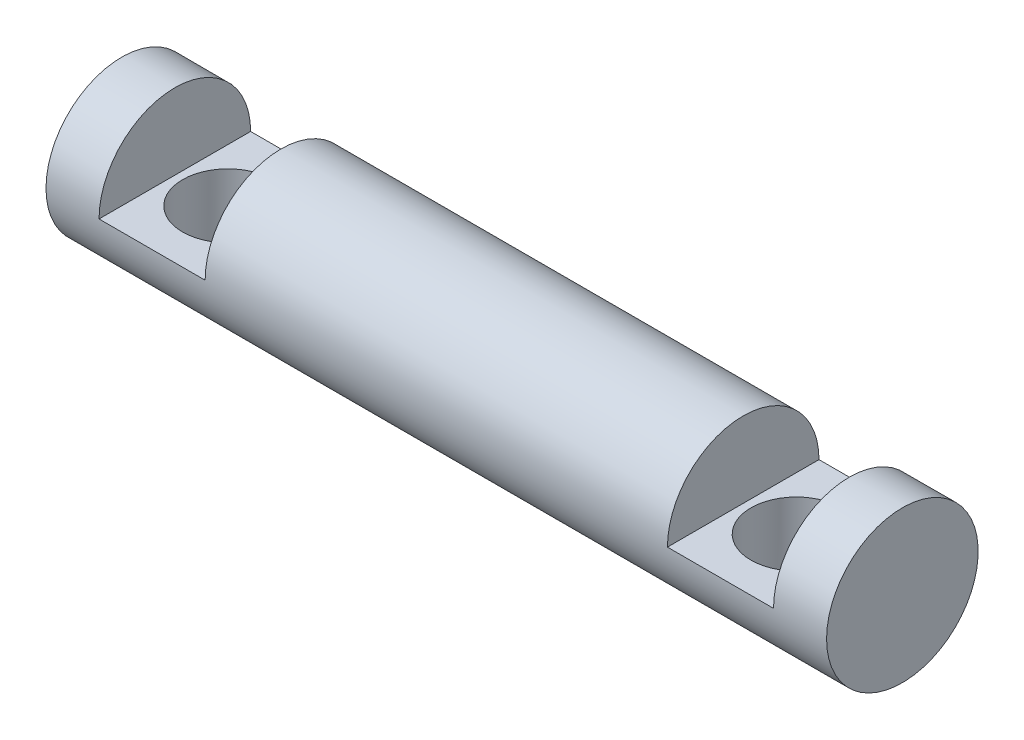
ISO-10303-21;
HEADER;
FILE_DESCRIPTION(('STEP AP214'),'2;1');
FILE_NAME('part.step','',(''),(''),'','','');
FILE_SCHEMA(('AUTOMOTIVE_DESIGN { 1 0 10303 214 1 1 1 1 }'));
ENDSEC;
DATA;
#1=APPLICATION_CONTEXT('core data for automotive mechanical design processes');
#2=APPLICATION_PROTOCOL_DEFINITION('international standard','automotive_design',2000,#1);
#3=PRODUCT_CONTEXT('',#1,'mechanical');
#4=PRODUCT('Part','Part','',(#3));
#5=PRODUCT_RELATED_PRODUCT_CATEGORY('part','',(#4));
#6=PRODUCT_DEFINITION_FORMATION('','',#4);
#7=PRODUCT_DEFINITION_CONTEXT('part definition',#1,'design');
#8=PRODUCT_DEFINITION('design','',#6,#7);
#9=PRODUCT_DEFINITION_SHAPE('','',#8);
#10=(LENGTH_UNIT() NAMED_UNIT(*) SI_UNIT(.MILLI.,.METRE.));
#11=(NAMED_UNIT(*) PLANE_ANGLE_UNIT() SI_UNIT($,.RADIAN.));
#12=(NAMED_UNIT(*) SI_UNIT($,.STERADIAN.) SOLID_ANGLE_UNIT());
#13=UNCERTAINTY_MEASURE_WITH_UNIT(LENGTH_MEASURE(1.E-05),#10,'distance_accuracy_value','');
#14=(GEOMETRIC_REPRESENTATION_CONTEXT(3) GLOBAL_UNCERTAINTY_ASSIGNED_CONTEXT((#13)) GLOBAL_UNIT_ASSIGNED_CONTEXT((#10,
#11,#12)) REPRESENTATION_CONTEXT('',''));
#15=CARTESIAN_POINT('',(0.,0.,0.));
#16=DIRECTION('',(0.,0.,1.));
#17=DIRECTION('',(1.,0.,0.));
#18=AXIS2_PLACEMENT_3D('',#15,#16,#17);
#19=CARTESIAN_POINT('',(-14.,-10.,0.));
#20=DIRECTION('',(0.,1.,0.));
#21=DIRECTION('',(0.,0.,1.));
#22=AXIS2_PLACEMENT_3D('',#19,#20,#21);
#23=CYLINDRICAL_SURFACE('',#22,5.983);
#24=CARTESIAN_POINT('',(-14.,-8.01272182220249,5.983));
#25=CARTESIAN_POINT('',(-13.8493695441967,-8.01272064223742,5.98300076916407));
#26=CARTESIAN_POINT('',(-13.6987483449007,-8.01698502855143,5.97730299767914));
#27=CARTESIAN_POINT('',(-13.39884228276,-8.03384631074094,5.9546211273175));
#28=CARTESIAN_POINT('',(-13.2495573423758,-8.0464427199133,5.93763768767662));
#29=CARTESIAN_POINT('',(-12.9534310774551,-8.07944003446093,5.89265839427143));
#30=CARTESIAN_POINT('',(-12.8065915267932,-8.0998463680192,5.86465488076986));
#31=CARTESIAN_POINT('',(-12.5164666998527,-8.14764147563162,5.79806944826703));
#32=CARTESIAN_POINT('',(-12.3731831393321,-8.17503355108398,5.75948252699081));
#33=CARTESIAN_POINT('',(-11.9521602604409,-8.26576135549159,5.62924153526379));
#34=CARTESIAN_POINT('',(-11.6807733757901,-8.33795262577153,5.52271927835578));
#35=CARTESIAN_POINT('',(-11.1600974946932,-8.49747006485556,5.27397201085588));
#36=CARTESIAN_POINT('',(-10.9108151971873,-8.58480079823949,5.13173622674491));
#37=CARTESIAN_POINT('',(-10.4078398665261,-8.77764464725458,4.79529529812044));
#38=CARTESIAN_POINT('',(-10.157290733131,-8.88407773305352,4.59687564718022));
#39=CARTESIAN_POINT('',(-9.80738818678048,-9.04272792957238,4.27127028550069));
#40=CARTESIAN_POINT('',(-9.69500521328284,-9.09548102430124,4.15798414985806));
#41=CARTESIAN_POINT('',(-9.47929621350256,-9.19954013728373,3.92237479570958));
#42=CARTESIAN_POINT('',(-9.37597185243732,-9.25084588830577,3.80004992322439));
#43=CARTESIAN_POINT('',(-9.16839892760712,-9.35624104863588,3.53319839301888));
#44=CARTESIAN_POINT('',(-9.06524785274892,-9.41003571488673,3.38769920063378));
#45=CARTESIAN_POINT('',(-8.87174306339386,-9.51293962780248,3.0869439703098));
#46=CARTESIAN_POINT('',(-8.78138363565049,-9.56205096300568,2.93169233320957));
#47=CARTESIAN_POINT('',(-8.61441219742821,-9.654191906075,2.61231434158258));
#48=CARTESIAN_POINT('',(-8.53779433174464,-9.69722410256142,2.4481918058769));
#49=CARTESIAN_POINT('',(-8.39927560657277,-9.77591805659406,2.11215187144233));
#50=CARTESIAN_POINT('',(-8.33737234539335,-9.81158101680932,1.94023575023008));
#51=CARTESIAN_POINT('',(-8.23437766418582,-9.87139954080665,1.60667280654932));
#52=CARTESIAN_POINT('',(-8.19186784459157,-9.89632642372464,1.4456018239102));
#53=CARTESIAN_POINT('',(-8.12030140486683,-9.93849728745583,1.11950408963652));
#54=CARTESIAN_POINT('',(-8.09124400805202,-9.95574171181858,0.954477566956375));
#55=CARTESIAN_POINT('',(-8.04706492545767,-9.98202543969841,0.622050603429007));
#56=CARTESIAN_POINT('',(-8.03193240655459,-9.99107112150071,0.454652111031144));
#57=CARTESIAN_POINT('',(-8.01582305654594,-10.0007020232273,0.118938798777263));
#58=CARTESIAN_POINT('',(-8.01484479730633,-10.0012880967077,-0.0493759269184598));
#59=CARTESIAN_POINT('',(-8.02629707983761,-9.99443968910751,-0.364504818510465));
#60=CARTESIAN_POINT('',(-8.03708429892086,-9.98798815722642,-0.51140368040195));
#61=CARTESIAN_POINT('',(-8.06939636151662,-9.96873116935379,-0.803645261549558));
#62=CARTESIAN_POINT('',(-8.09092470726321,-9.95592364094377,-0.948987457442608));
#63=CARTESIAN_POINT('',(-8.14444144400251,-9.92425376260531,-1.23700119956707));
#64=CARTESIAN_POINT('',(-8.1764261598526,-9.90539354008437,-1.37967366553896));
#65=CARTESIAN_POINT('',(-8.25049540835462,-9.86202886115965,-1.66154510619376));
#66=CARTESIAN_POINT('',(-8.29258383733036,-9.83752222746118,-1.80074271794079));
#67=CARTESIAN_POINT('',(-8.38667044531237,-9.78323534036892,-2.07557937926213));
#68=CARTESIAN_POINT('',(-8.43872226347756,-9.75342660689977,-2.21119442550948));
#69=CARTESIAN_POINT('',(-8.55208755150195,-9.68923557027812,-2.4773967793952));
#70=CARTESIAN_POINT('',(-8.61340431718571,-9.65485164011024,-2.60798227704187));
#71=CARTESIAN_POINT('',(-8.81047416875749,-9.54582893551309,-2.99124330840834));
#72=CARTESIAN_POINT('',(-8.95941105371891,-9.46528123714766,-3.23560885139138));
#73=CARTESIAN_POINT('',(-9.30796531377764,-9.28407918781992,-3.72588355824065));
#74=CARTESIAN_POINT('',(-9.51150584986742,-9.18217270311487,-3.96851119761714));
#75=CARTESIAN_POINT('',(-9.95354251781596,-8.97437551717999,-4.418368832624));
#76=CARTESIAN_POINT('',(-10.1920856909292,-8.86847959903703,-4.62555036644221));
#77=CARTESIAN_POINT('',(-10.5877403910169,-8.70807118302473,-4.91770378702827));
#78=CARTESIAN_POINT('',(-10.7342337575479,-8.65153813867862,-5.01621266399574));
#79=CARTESIAN_POINT('',(-11.036415835905,-8.54205515909008,-5.20045751307669));
#80=CARTESIAN_POINT('',(-11.1921060394991,-8.48910580814401,-5.28619140504241));
#81=CARTESIAN_POINT('',(-11.5117119044083,-8.38882025951527,-5.44393495455025));
#82=CARTESIAN_POINT('',(-11.6756147753102,-8.34147569730534,-5.51596516340463));
#83=CARTESIAN_POINT('',(-12.0109587770589,-8.25432171323408,-5.64555392250756));
#84=CARTESIAN_POINT('',(-12.1823969344854,-8.21450935148779,-5.70311812186046));
#85=CARTESIAN_POINT('',(-12.4884921352161,-8.15302112355933,-5.79053988399941));
#86=CARTESIAN_POINT('',(-12.6217940247644,-8.12929384797482,-5.8237293352486));
#87=CARTESIAN_POINT('',(-12.8912679795097,-8.08797178460469,-5.88098319476085));
#88=CARTESIAN_POINT('',(-13.0274394082945,-8.07037565191023,-5.90504960432856));
#89=CARTESIAN_POINT('',(-13.301690066418,-8.04193803326901,-5.94372027722393));
#90=CARTESIAN_POINT('',(-13.4397673563362,-8.03109013352325,-5.9583335257545));
#91=CARTESIAN_POINT('',(-13.7169869287104,-8.01652362501854,-5.97791767234611));
#92=CARTESIAN_POINT('',(-13.8561292340174,-8.01280516966252,-5.98288836293002));
#93=CARTESIAN_POINT('',(-14.1346100650127,-8.01264114951788,-5.98310805489964));
#94=CARTESIAN_POINT('',(-14.2739486072178,-8.01620519365379,-5.97834421201388));
#95=CARTESIAN_POINT('',(-14.5515821759019,-8.03048745872211,-5.95914526132916));
#96=CARTESIAN_POINT('',(-14.6898771970135,-8.0412057164262,-5.94471010382094));
#97=CARTESIAN_POINT('',(-14.9645153133849,-8.06940751142638,-5.90637176329846));
#98=CARTESIAN_POINT('',(-15.1008574419148,-8.08689428691881,-5.88246404829075));
#99=CARTESIAN_POINT('',(-15.3706932083968,-8.1280188054873,-5.82550731341103));
#100=CARTESIAN_POINT('',(-15.5041856603671,-8.15165905753131,-5.79245456447129));
#101=CARTESIAN_POINT('',(-15.8990572986649,-8.23066350006933,-5.68019283837786));
#102=CARTESIAN_POINT('',(-16.1552071394002,-8.29415340583934,-5.58782650554205));
#103=CARTESIAN_POINT('',(-16.6490522486616,-8.43593183154593,-5.3713818559533));
#104=CARTESIAN_POINT('',(-16.8867404783902,-8.51422595714442,-5.24729152052588));
#105=CARTESIAN_POINT('',(-17.382424296076,-8.69379030137845,-4.94510654755516));
#106=CARTESIAN_POINT('',(-17.6364063257457,-8.79666204440342,-4.76131630780502));
#107=CARTESIAN_POINT('',(-17.9932379914118,-8.95199474555176,-4.45811381784626));
#108=CARTESIAN_POINT('',(-18.1082385555798,-9.00398410439697,-4.35236690475312));
#109=CARTESIAN_POINT('',(-18.3298363189522,-9.10722655605007,-4.13197446075146));
#110=CARTESIAN_POINT('',(-18.4364320323013,-9.15847951736975,-4.01732736349791));
#111=CARTESIAN_POINT('',(-18.6538035736424,-9.26561058833825,-3.76426499577172));
#112=CARTESIAN_POINT('',(-18.7633554681407,-9.32123638058279,-3.62468882813529));
#113=CARTESIAN_POINT('',(-18.9702020193509,-9.4286165617675,-3.33541279813996));
#114=CARTESIAN_POINT('',(-19.0675016553776,-9.4803725199109,-3.18571708662085));
#115=CARTESIAN_POINT('',(-19.2489554259704,-9.57859205618555,-2.87694481209013));
#116=CARTESIAN_POINT('',(-19.3331126462884,-9.62505687594499,-2.71787046323975));
#117=CARTESIAN_POINT('',(-19.4873110120881,-9.71134434422112,-2.39129657813955));
#118=CARTESIAN_POINT('',(-19.5573540874341,-9.75116790068672,-2.22379819764876));
#119=CARTESIAN_POINT('',(-19.6777555848786,-9.82030416756387,-1.89416788789085));
#120=CARTESIAN_POINT('',(-19.7291805377201,-9.85017334517986,-1.73254250614257));
#121=CARTESIAN_POINT('',(-19.8183338031475,-9.9022931198655,-1.40434584828177));
#122=CARTESIAN_POINT('',(-19.8560626356142,-9.92454400611021,-1.23777476015922));
#123=CARTESIAN_POINT('',(-19.917193383354,-9.96073701499938,-0.901290161059272));
#124=CARTESIAN_POINT('',(-19.9406086017847,-9.97468685236652,-0.731379905614252));
#125=CARTESIAN_POINT('',(-19.9727598570552,-9.9938682289815,-0.389694564109099));
#126=CARTESIAN_POINT('',(-19.9814977755949,-9.99910088581274,-0.217919719940547));
#127=CARTESIAN_POINT('',(-19.9839717170663,-10.000581669364,0.102981889168155));
#128=CARTESIAN_POINT('',(-19.9795422819112,-9.9979284977738,0.252093449395299));
#129=CARTESIAN_POINT('',(-19.9595914305091,-9.9860089972031,0.549306698574354));
#130=CARTESIAN_POINT('',(-19.9440702782624,-9.9767428256224,0.697408411477514));
#131=CARTESIAN_POINT('',(-19.9021414493221,-9.95181899650119,0.991503577720525));
#132=CARTESIAN_POINT('',(-19.8757342831972,-9.9361616387163,1.13749712960364));
#133=CARTESIAN_POINT('',(-19.8123649207155,-9.89882026197122,1.42638527794543));
#134=CARTESIAN_POINT('',(-19.7754024028243,-9.87713605942338,1.56927977985895));
#135=CARTESIAN_POINT('',(-19.6919816384061,-9.82859256232503,1.84894553803293));
#136=CARTESIAN_POINT('',(-19.6456756255633,-9.80181658681472,1.98577674530442));
#137=CARTESIAN_POINT('',(-19.5437018531575,-9.74343890823917,2.25485854369877));
#138=CARTESIAN_POINT('',(-19.4880310598068,-9.71183564164449,2.38710763361452));
#139=CARTESIAN_POINT('',(-19.3077175439051,-9.61070281482898,2.77595831440019));
#140=CARTESIAN_POINT('',(-19.1697144311881,-9.53481486978578,3.02485941306702));
#141=CARTESIAN_POINT('',(-18.8454170755404,-9.3627377786203,3.52367290425508));
#142=CARTESIAN_POINT('',(-18.6555032006902,-9.26523835504876,3.77075141561829));
#143=CARTESIAN_POINT('',(-18.2409954031973,-9.06404235493719,4.23159002951521));
#144=CARTESIAN_POINT('',(-18.0163627208972,-8.96033893262195,4.44531235100054));
#145=CARTESIAN_POINT('',(-17.6412618336267,-8.80043212549768,4.75056595747516));
#146=CARTESIAN_POINT('',(-17.5012545031753,-8.74326578549943,4.85469472816387));
#147=CARTESIAN_POINT('',(-17.211899670652,-8.63146537677397,5.05079450922765));
#148=CARTESIAN_POINT('',(-17.0625498846735,-8.57683193298051,5.14276252947544));
#149=CARTESIAN_POINT('',(-16.7551917173342,-8.47194988111723,5.31376837955461));
#150=CARTESIAN_POINT('',(-16.597185090061,-8.42170039006162,5.39280881598984));
#151=CARTESIAN_POINT('',(-16.2732970522639,-8.32752168936161,5.53712987253749));
#152=CARTESIAN_POINT('',(-16.1074210802458,-8.28358819697648,5.60241983064973));
#153=CARTESIAN_POINT('',(-15.78463866472,-8.20770442689693,5.71293744193132));
#154=CARTESIAN_POINT('',(-15.6283549754565,-8.17501588819395,5.75947412324478));
#155=CARTESIAN_POINT('',(-15.311176679106,-8.11779511350028,5.8398495500009));
#156=CARTESIAN_POINT('',(-15.150285104605,-8.09325764120975,5.87369644924968));
#157=CARTESIAN_POINT('',(-14.8253685922711,-8.05350833339582,5.92808089753495));
#158=CARTESIAN_POINT('',(-14.6613487440117,-8.03828249423287,5.94863843493248));
#159=CARTESIAN_POINT('',(-14.3315487291852,-8.01789044412064,5.97609680783654));
#160=CARTESIAN_POINT('',(-14.1657687593173,-8.01272312075359,5.98299915353524));
#161=CARTESIAN_POINT('',(-14.,-8.01272182220249,5.983));
#162=B_SPLINE_CURVE_WITH_KNOTS('',3,(#24,#25,#26,#27,#28,#29,#30,#31,#32,#33,#34,#35,#36,#37,
#38,#39,#40,#41,#42,#43,#44,#45,#46,#47,#48,#49,#50,#51,#52,#53,#54,#55,#56,#57,#58,#59,#60,#61,
#62,#63,#64,#65,#66,#67,#68,#69,#70,#71,#72,#73,#74,#75,#76,#77,#78,#79,#80,#81,#82,#83,#84,#85,
#86,#87,#88,#89,#90,#91,#92,#93,#94,#95,#96,#97,#98,#99,#100,#101,#102,#103,#104,#105,#106,#107,
#108,#109,#110,#111,#112,#113,#114,#115,#116,#117,#118,#119,#120,#121,#122,#123,#124,#125,#126,
#127,#128,#129,#130,#131,#132,#133,#134,#135,#136,#137,#138,#139,#140,#141,#142,#143,#144,#145,
#146,#147,#148,#149,#150,#151,#152,#153,#154,#155,#156,#157,#158,#159,#160,#161),.UNSPECIFIED.,
.T.,.F.,(4,2,2,2,2,2,2,2,2,2,2,2,2,2,2,2,2,2,2,2,2,2,2,2,2,2,2,2,2,2,2,2,2,2,2,2,2,2,2,2,2,2,2,
2,2,2,2,2,2,2,2,2,2,2,2,2,2,2,2,2,2,2,2,2,2,2,2,2,4),(0.,0.451709047346675,0.903391711088059,
1.35538888259685,1.80760006099145,2.70454700171403,3.60176484564896,4.60799204644237,
5.11180552428526,5.61571142329459,6.17385340051518,6.73174529797645,7.2893989130495,
7.84696144631437,8.35155852130122,8.85612645941584,9.36030152662058,9.86442572330245,
10.3062041903912,10.7481267972679,11.1898942465134,11.631832330249,12.0762201972984,
12.5207665204705,13.4092655997762,14.4035706643091,15.399224460951,15.9547362159554,
16.5103383261925,17.0651005199553,17.6196457363586,18.0374406282247,18.4551438160943,
18.8724493926191,19.2897639481307,19.7076294866372,20.1254971729331,20.5435650232098,
20.9618036007745,21.7971461313442,22.6328056025754,23.6184705099789,24.1120734231972,
24.6057634034774,25.1629125996724,25.7198346347546,26.2766257110052,26.8333406040064,
27.3492495133178,27.8651388375895,28.3805479593832,28.8958909982247,29.3429431294541,
29.7899846204973,30.2370051470745,30.6840392921274,31.1243055163002,31.5647146435229,
32.4449158462116,33.4208424912916,34.3978666254299,34.948148257572,35.4985649442481,
36.0488705125808,36.5988011526856,37.0970331185636,37.5949443951045,38.0921050163126,
38.5892106511045),.UNSPECIFIED.);
#163=CARTESIAN_POINT('',(-14.,-8.01272182220249,5.983));
#164=VERTEX_POINT('',#163);
#165=EDGE_CURVE('E132',#164,#164,#162,.T.);
#166=ORIENTED_EDGE('',*,*,#165,.F.);
#167=EDGE_LOOP('',(#166));
#168=FACE_BOUND('',#167,.T.);
#169=CARTESIAN_POINT('',(-14.,0.,0.));
#170=DIRECTION('',(0.,1.,0.));
#171=DIRECTION('',(0.,0.,1.));
#172=AXIS2_PLACEMENT_3D('',#169,#170,#171);
#173=CIRCLE('',#172,5.983);
#174=CARTESIAN_POINT('',(-14.,0.,5.983));
#175=VERTEX_POINT('',#174);
#176=EDGE_CURVE('E103',#175,#175,#173,.F.);
#177=ORIENTED_EDGE('',*,*,#176,.F.);
#178=EDGE_LOOP('',(#177));
#179=FACE_BOUND('',#178,.T.);
#180=ADVANCED_FACE('F40',(#168,#179),#23,.F.);
#181=CARTESIAN_POINT('',(-103.,0.,0.));
#182=DIRECTION('',(-1.,0.,0.));
#183=DIRECTION('',(0.,0.,1.));
#184=AXIS2_PLACEMENT_3D('',#181,#182,#183);
#185=CYLINDRICAL_SURFACE('',#184,10.);
#186=CARTESIAN_POINT('',(-82.,0.,0.));
#187=DIRECTION('',(-1.,0.,0.));
#188=DIRECTION('',(0.,0.,1.));
#189=AXIS2_PLACEMENT_3D('',#186,#187,#188);
#190=CIRCLE('',#189,10.);
#191=CARTESIAN_POINT('',(-82.,0.,10.));
#192=VERTEX_POINT('',#191);
#193=CARTESIAN_POINT('',(-82.,0.,-10.));
#194=VERTEX_POINT('',#193);
#195=EDGE_CURVE('E11',#192,#194,#190,.T.);
#196=ORIENTED_EDGE('',*,*,#195,.F.);
#197=DIRECTION('',(-1.,0.,0.));
#198=VECTOR('',#197,1.);
#199=CARTESIAN_POINT('',(-103.,0.,10.));
#200=LINE('',#199,#198);
#201=CARTESIAN_POINT('',(-96.,0.,10.));
#202=VERTEX_POINT('',#201);
#203=EDGE_CURVE('E120',#192,#202,#200,.T.);
#204=ORIENTED_EDGE('',*,*,#203,.T.);
#205=CARTESIAN_POINT('',(-96.,0.,0.));
#206=DIRECTION('',(-1.,0.,0.));
#207=DIRECTION('',(0.,0.,1.));
#208=AXIS2_PLACEMENT_3D('',#205,#206,#207);
#209=CIRCLE('',#208,10.);
#210=CARTESIAN_POINT('',(-96.,0.,-10.));
#211=VERTEX_POINT('',#210);
#212=EDGE_CURVE('E50',#202,#211,#209,.T.);
#213=ORIENTED_EDGE('',*,*,#212,.T.);
#214=DIRECTION('',(-1.,0.,0.));
#215=VECTOR('',#214,1.);
#216=CARTESIAN_POINT('',(-103.,0.,-10.));
#217=LINE('',#216,#215);
#218=EDGE_CURVE('E117',#211,#194,#217,.F.);
#219=ORIENTED_EDGE('',*,*,#218,.T.);
#220=EDGE_LOOP('',(#196,#204,#213,#219));
#221=FACE_BOUND('',#220,.T.);
#222=DIRECTION('',(-1.,0.,0.));
#223=VECTOR('',#222,1.);
#224=CARTESIAN_POINT('',(-103.,0.,-10.));
#225=LINE('',#224,#223);
#226=CARTESIAN_POINT('',(-7.00000000000001,0.,-10.));
#227=VERTEX_POINT('',#226);
#228=CARTESIAN_POINT('',(-21.,0.,-10.));
#229=VERTEX_POINT('',#228);
#230=EDGE_CURVE('E88',#227,#229,#225,.T.);
#231=ORIENTED_EDGE('',*,*,#230,.F.);
#232=CARTESIAN_POINT('',(-7.00000000000001,0.,0.));
#233=DIRECTION('',(1.,0.,0.));
#234=DIRECTION('',(0.,0.,-1.));
#235=AXIS2_PLACEMENT_3D('',#232,#233,#234);
#236=CIRCLE('',#235,10.);
#237=CARTESIAN_POINT('',(-7.00000000000001,0.,10.));
#238=VERTEX_POINT('',#237);
#239=EDGE_CURVE('E82',#227,#238,#236,.T.);
#240=ORIENTED_EDGE('',*,*,#239,.T.);
#241=DIRECTION('',(-1.,0.,0.));
#242=VECTOR('',#241,1.);
#243=CARTESIAN_POINT('',(-103.,0.,10.));
#244=LINE('',#243,#242);
#245=CARTESIAN_POINT('',(-21.,0.,10.));
#246=VERTEX_POINT('',#245);
#247=EDGE_CURVE('E86',#246,#238,#244,.F.);
#248=ORIENTED_EDGE('',*,*,#247,.F.);
#249=CARTESIAN_POINT('',(-21.,0.,0.));
#250=DIRECTION('',(1.,0.,0.));
#251=DIRECTION('',(0.,0.,-1.));
#252=AXIS2_PLACEMENT_3D('',#249,#250,#251);
#253=CIRCLE('',#252,10.);
#254=EDGE_CURVE('E93',#229,#246,#253,.T.);
#255=ORIENTED_EDGE('',*,*,#254,.F.);
#256=EDGE_LOOP('',(#231,#240,#248,#255));
#257=FACE_BOUND('',#256,.T.);
#258=CARTESIAN_POINT('',(-89.,-8.01272182220249,5.98300000000001));
#259=CARTESIAN_POINT('',(-88.8493695441967,-8.01272064223742,5.98300076916407));
#260=CARTESIAN_POINT('',(-88.6987483449007,-8.01698502855143,5.97730299767915));
#261=CARTESIAN_POINT('',(-88.3988422827599,-8.03384631074094,5.95462112731751));
#262=CARTESIAN_POINT('',(-88.2495573423758,-8.0464427199133,5.93763768767662));
#263=CARTESIAN_POINT('',(-87.9534310774551,-8.07944003446093,5.89265839427143));
#264=CARTESIAN_POINT('',(-87.8065915267932,-8.0998463680192,5.86465488076986));
#265=CARTESIAN_POINT('',(-87.5164666998527,-8.14764147563162,5.79806944826704));
#266=CARTESIAN_POINT('',(-87.3731831393321,-8.17503355108398,5.75948252699081));
#267=CARTESIAN_POINT('',(-86.9521602604409,-8.26576135549159,5.6292415352638));
#268=CARTESIAN_POINT('',(-86.6807733757901,-8.33795262577152,5.52271927835579));
#269=CARTESIAN_POINT('',(-86.1600974946932,-8.49747006485556,5.27397201085588));
#270=CARTESIAN_POINT('',(-85.9108151971873,-8.58480079823948,5.13173622674491));
#271=CARTESIAN_POINT('',(-85.4078398665261,-8.77764464725457,4.79529529812045));
#272=CARTESIAN_POINT('',(-85.157290733131,-8.88407773305352,4.59687564718023));
#273=CARTESIAN_POINT('',(-84.8073881867805,-9.04272792957237,4.27127028550071));
#274=CARTESIAN_POINT('',(-84.6950052132828,-9.09548102430123,4.15798414985808));
#275=CARTESIAN_POINT('',(-84.4792962135025,-9.19954013728372,3.92237479570959));
#276=CARTESIAN_POINT('',(-84.3759718524373,-9.25084588830577,3.8000499232244));
#277=CARTESIAN_POINT('',(-84.1683989276071,-9.35624104863587,3.53319839301889));
#278=CARTESIAN_POINT('',(-84.0652478527489,-9.41003571488673,3.3876992006338));
#279=CARTESIAN_POINT('',(-83.8717430633939,-9.51293962780247,3.08694397030981));
#280=CARTESIAN_POINT('',(-83.7813836356505,-9.56205096300568,2.93169233320958));
#281=CARTESIAN_POINT('',(-83.6144121974282,-9.654191906075,2.61231434158259));
#282=CARTESIAN_POINT('',(-83.5377943317446,-9.69722410256142,2.44819180587691));
#283=CARTESIAN_POINT('',(-83.3992756065727,-9.77591805659406,2.11215187144234));
#284=CARTESIAN_POINT('',(-83.3373723453933,-9.81158101680932,1.94023575023009));
#285=CARTESIAN_POINT('',(-83.2343776641858,-9.87139954080665,1.60667280654932));
#286=CARTESIAN_POINT('',(-83.1918678445916,-9.89632642372464,1.44560182391021));
#287=CARTESIAN_POINT('',(-83.1203014048668,-9.93849728745583,1.11950408963653));
#288=CARTESIAN_POINT('',(-83.091244008052,-9.95574171181857,0.954477566956382));
#289=CARTESIAN_POINT('',(-83.0470649254576,-9.98202543969841,0.622050603429015));
#290=CARTESIAN_POINT('',(-83.0319324065546,-9.99107112150071,0.454652111031152));
#291=CARTESIAN_POINT('',(-83.0158230565459,-10.0007020232273,0.118938798777271));
#292=CARTESIAN_POINT('',(-83.0148447973063,-10.0012880967077,-0.0493759269184521));
#293=CARTESIAN_POINT('',(-83.0262970798376,-9.99443968910751,-0.364504818510457));
#294=CARTESIAN_POINT('',(-83.0370842989208,-9.98798815722642,-0.511403680401942));
#295=CARTESIAN_POINT('',(-83.0693963615166,-9.96873116935379,-0.803645261549549));
#296=CARTESIAN_POINT('',(-83.0909247072632,-9.95592364094377,-0.948987457442598));
#297=CARTESIAN_POINT('',(-83.1444414440025,-9.92425376260532,-1.23700119956706));
#298=CARTESIAN_POINT('',(-83.1764261598526,-9.90539354008437,-1.37967366553895));
#299=CARTESIAN_POINT('',(-83.2504954083546,-9.86202886115965,-1.66154510619375));
#300=CARTESIAN_POINT('',(-83.2925838373303,-9.83752222746118,-1.80074271794078));
#301=CARTESIAN_POINT('',(-83.3866704453123,-9.78323534036892,-2.07557937926212));
#302=CARTESIAN_POINT('',(-83.4387222634775,-9.75342660689977,-2.21119442550947));
#303=CARTESIAN_POINT('',(-83.5520875515019,-9.68923557027813,-2.47739677939519));
#304=CARTESIAN_POINT('',(-83.6134043171857,-9.65485164011024,-2.60798227704186));
#305=CARTESIAN_POINT('',(-83.8104741687575,-9.54582893551309,-2.99124330840833));
#306=CARTESIAN_POINT('',(-83.9594110537189,-9.46528123714766,-3.23560885139137));
#307=CARTESIAN_POINT('',(-84.3079653137776,-9.28407918781992,-3.72588355824065));
#308=CARTESIAN_POINT('',(-84.5115058498674,-9.18217270311488,-3.96851119761713));
#309=CARTESIAN_POINT('',(-84.9535425178159,-8.97437551717999,-4.41836883262399));
#310=CARTESIAN_POINT('',(-85.1920856909291,-8.86847959903703,-4.62555036644221));
#311=CARTESIAN_POINT('',(-85.5877403910169,-8.70807118302473,-4.91770378702827));
#312=CARTESIAN_POINT('',(-85.7342337575478,-8.65153813867862,-5.01621266399574));
#313=CARTESIAN_POINT('',(-86.0364158359049,-8.54205515909008,-5.20045751307668));
#314=CARTESIAN_POINT('',(-86.1921060394991,-8.48910580814401,-5.28619140504241));
#315=CARTESIAN_POINT('',(-86.5117119044083,-8.38882025951527,-5.44393495455025));
#316=CARTESIAN_POINT('',(-86.6756147753102,-8.34147569730534,-5.51596516340464));
#317=CARTESIAN_POINT('',(-87.0109587770588,-8.25432171323407,-5.64555392250757));
#318=CARTESIAN_POINT('',(-87.1823969344853,-8.21450935148779,-5.70311812186046));
#319=CARTESIAN_POINT('',(-87.4884921352161,-8.15302112355933,-5.79053988399941));
#320=CARTESIAN_POINT('',(-87.6217940247644,-8.12929384797482,-5.8237293352486));
#321=CARTESIAN_POINT('',(-87.8912679795097,-8.08797178460469,-5.88098319476086));
#322=CARTESIAN_POINT('',(-88.0274394082945,-8.07037565191022,-5.90504960432856));
#323=CARTESIAN_POINT('',(-88.301690066418,-8.041938033269,-5.94372027722394));
#324=CARTESIAN_POINT('',(-88.4397673563362,-8.03109013352325,-5.95833352575451));
#325=CARTESIAN_POINT('',(-88.7169869287104,-8.01652362501854,-5.97791767234612));
#326=CARTESIAN_POINT('',(-88.8561292340174,-8.01280516966252,-5.98288836293002));
#327=CARTESIAN_POINT('',(-89.1346100650127,-8.01264114951787,-5.98310805489964));
#328=CARTESIAN_POINT('',(-89.2739486072178,-8.01620519365379,-5.97834421201388));
#329=CARTESIAN_POINT('',(-89.5515821759019,-8.03048745872211,-5.95914526132916));
#330=CARTESIAN_POINT('',(-89.6898771970135,-8.0412057164262,-5.94471010382094));
#331=CARTESIAN_POINT('',(-89.9645153133849,-8.06940751142638,-5.90637176329846));
#332=CARTESIAN_POINT('',(-90.1008574419148,-8.08689428691881,-5.88246404829075));
#333=CARTESIAN_POINT('',(-90.3706932083969,-8.12801880548731,-5.82550731341103));
#334=CARTESIAN_POINT('',(-90.5041856603671,-8.15165905753131,-5.79245456447129));
#335=CARTESIAN_POINT('',(-90.8990572986649,-8.23066350006933,-5.68019283837786));
#336=CARTESIAN_POINT('',(-91.1552071394002,-8.29415340583934,-5.58782650554204));
#337=CARTESIAN_POINT('',(-91.6490522486616,-8.43593183154594,-5.37138185595329));
#338=CARTESIAN_POINT('',(-91.8867404783902,-8.51422595714442,-5.24729152052587));
#339=CARTESIAN_POINT('',(-92.382424296076,-8.69379030137845,-4.94510654755516));
#340=CARTESIAN_POINT('',(-92.6364063257457,-8.79666204440342,-4.76131630780502));
#341=CARTESIAN_POINT('',(-92.9932379914118,-8.95199474555176,-4.45811381784627));
#342=CARTESIAN_POINT('',(-93.1082385555798,-9.00398410439696,-4.35236690475313));
#343=CARTESIAN_POINT('',(-93.3298363189521,-9.10722655605006,-4.13197446075147));
#344=CARTESIAN_POINT('',(-93.4364320323013,-9.15847951736975,-4.01732736349792));
#345=CARTESIAN_POINT('',(-93.6538035736423,-9.26561058833824,-3.76426499577172));
#346=CARTESIAN_POINT('',(-93.7633554681407,-9.32123638058279,-3.6246888281353));
#347=CARTESIAN_POINT('',(-93.9702020193509,-9.4286165617675,-3.33541279813997));
#348=CARTESIAN_POINT('',(-94.0675016553776,-9.48037251991089,-3.18571708662086));
#349=CARTESIAN_POINT('',(-94.2489554259704,-9.57859205618555,-2.87694481209014));
#350=CARTESIAN_POINT('',(-94.3331126462884,-9.62505687594499,-2.71787046323976));
#351=CARTESIAN_POINT('',(-94.4873110120881,-9.71134434422112,-2.39129657813955));
#352=CARTESIAN_POINT('',(-94.557354087434,-9.75116790068672,-2.22379819764876));
#353=CARTESIAN_POINT('',(-94.6777555848786,-9.82030416756388,-1.89416788789084));
#354=CARTESIAN_POINT('',(-94.72918053772,-9.85017334517986,-1.73254250614256));
#355=CARTESIAN_POINT('',(-94.8183338031475,-9.9022931198655,-1.40434584828176));
#356=CARTESIAN_POINT('',(-94.8560626356142,-9.92454400611021,-1.23777476015921));
#357=CARTESIAN_POINT('',(-94.917193383354,-9.96073701499938,-0.901290161059266));
#358=CARTESIAN_POINT('',(-94.9406086017846,-9.97468685236652,-0.731379905614245));
#359=CARTESIAN_POINT('',(-94.9727598570552,-9.9938682289815,-0.389694564109092));
#360=CARTESIAN_POINT('',(-94.9814977755949,-9.99910088581274,-0.21791971994054));
#361=CARTESIAN_POINT('',(-94.9839717170663,-10.000581669364,0.102981889168161));
#362=CARTESIAN_POINT('',(-94.9795422819112,-9.9979284977738,0.252093449395305));
#363=CARTESIAN_POINT('',(-94.9595914305091,-9.9860089972031,0.549306698574361));
#364=CARTESIAN_POINT('',(-94.9440702782624,-9.9767428256224,0.697408411477522));
#365=CARTESIAN_POINT('',(-94.902141449322,-9.95181899650118,0.991503577720533));
#366=CARTESIAN_POINT('',(-94.8757342831971,-9.9361616387163,1.13749712960365));
#367=CARTESIAN_POINT('',(-94.8123649207155,-9.89882026197122,1.42638527794544));
#368=CARTESIAN_POINT('',(-94.7754024028243,-9.87713605942338,1.56927977985896));
#369=CARTESIAN_POINT('',(-94.6919816384061,-9.82859256232503,1.84894553803294));
#370=CARTESIAN_POINT('',(-94.6456756255632,-9.80181658681472,1.98577674530442));
#371=CARTESIAN_POINT('',(-94.5437018531575,-9.74343890823917,2.25485854369877));
#372=CARTESIAN_POINT('',(-94.4880310598068,-9.71183564164449,2.38710763361452));
#373=CARTESIAN_POINT('',(-94.3077175439051,-9.61070281482897,2.7759583144002));
#374=CARTESIAN_POINT('',(-94.1697144311881,-9.53481486978578,3.02485941306703));
#375=CARTESIAN_POINT('',(-93.8454170755404,-9.3627377786203,3.52367290425509));
#376=CARTESIAN_POINT('',(-93.6555032006902,-9.26523835504875,3.7707514156183));
#377=CARTESIAN_POINT('',(-93.2409954031973,-9.06404235493718,4.23159002951522));
#378=CARTESIAN_POINT('',(-93.0163627208972,-8.96033893262195,4.44531235100055));
#379=CARTESIAN_POINT('',(-92.6412618336266,-8.80043212549768,4.75056595747517));
#380=CARTESIAN_POINT('',(-92.5012545031753,-8.74326578549942,4.85469472816388));
#381=CARTESIAN_POINT('',(-92.211899670652,-8.63146537677396,5.05079450922767));
#382=CARTESIAN_POINT('',(-92.0625498846735,-8.5768319329805,5.14276252947545));
#383=CARTESIAN_POINT('',(-91.7551917173342,-8.47194988111722,5.31376837955461));
#384=CARTESIAN_POINT('',(-91.597185090061,-8.42170039006161,5.39280881598985));
#385=CARTESIAN_POINT('',(-91.2732970522639,-8.32752168936161,5.5371298725375));
#386=CARTESIAN_POINT('',(-91.1074210802458,-8.28358819697648,5.60241983064973));
#387=CARTESIAN_POINT('',(-90.78463866472,-8.20770442689692,5.71293744193133));
#388=CARTESIAN_POINT('',(-90.6283549754564,-8.17501588819394,5.75947412324479));
#389=CARTESIAN_POINT('',(-90.311176679106,-8.11779511350027,5.83984955000091));
#390=CARTESIAN_POINT('',(-90.1502851046049,-8.09325764120974,5.87369644924969));
#391=CARTESIAN_POINT('',(-89.8253685922711,-8.05350833339581,5.92808089753495));
#392=CARTESIAN_POINT('',(-89.6613487440117,-8.03828249423286,5.94863843493248));
#393=CARTESIAN_POINT('',(-89.3315487291852,-8.01789044412063,5.97609680783655));
#394=CARTESIAN_POINT('',(-89.1657687593173,-8.01272312075359,5.98299915353524));
#395=CARTESIAN_POINT('',(-89.,-8.01272182220249,5.98300000000001));
#396=B_SPLINE_CURVE_WITH_KNOTS('',3,(#258,#259,#260,#261,#262,#263,#264,#265,#266,#267,#268,
#269,#270,#271,#272,#273,#274,#275,#276,#277,#278,#279,#280,#281,#282,#283,#284,#285,#286,#287,
#288,#289,#290,#291,#292,#293,#294,#295,#296,#297,#298,#299,#300,#301,#302,#303,#304,#305,#306,
#307,#308,#309,#310,#311,#312,#313,#314,#315,#316,#317,#318,#319,#320,#321,#322,#323,#324,#325,
#326,#327,#328,#329,#330,#331,#332,#333,#334,#335,#336,#337,#338,#339,#340,#341,#342,#343,#344,
#345,#346,#347,#348,#349,#350,#351,#352,#353,#354,#355,#356,#357,#358,#359,#360,#361,#362,#363,
#364,#365,#366,#367,#368,#369,#370,#371,#372,#373,#374,#375,#376,#377,#378,#379,#380,#381,#382,
#383,#384,#385,#386,#387,#388,#389,#390,#391,#392,#393,#394,#395),.UNSPECIFIED.,.T.,.F.,(4,2,2,
2,2,2,2,2,2,2,2,2,2,2,2,2,2,2,2,2,2,2,2,2,2,2,2,2,2,2,2,2,2,2,2,2,2,2,2,2,2,2,2,2,2,2,2,2,2,2,2,
2,2,2,2,2,2,2,2,2,2,2,2,2,2,2,2,2,4),(0.,0.451709047346672,0.903391711088071,1.35538888259686,
1.80760006099144,2.70454700171403,3.60176484564895,4.60799204644236,5.11180552428526,
5.61571142329459,6.17385340051518,6.73174529797644,7.2893989130495,7.84696144631437,
8.35155852130122,8.85612645941584,9.36030152662058,9.86442572330245,10.3062041903912,
10.7481267972679,11.1898942465134,11.631832330249,12.0762201972984,12.5207665204705,
13.4092655997762,14.4035706643091,15.399224460951,15.9547362159554,16.5103383261925,
17.0651005199553,17.6196457363586,18.0374406282247,18.4551438160943,18.8724493926191,
19.2897639481307,19.7076294866373,20.1254971729331,20.5435650232099,20.9618036007745,
21.7971461313442,22.6328056025755,23.6184705099789,24.1120734231972,24.6057634034774,
25.1629125996724,25.7198346347546,26.2766257110053,26.8333406040065,27.3492495133178,
27.8651388375896,28.3805479593832,28.8958909982247,29.3429431294542,29.7899846204974,
30.2370051470745,30.6840392921274,31.1243055163002,31.5647146435229,32.4449158462116,
33.4208424912917,34.39786662543,34.9481482575721,35.4985649442482,36.0488705125809,
36.5988011526857,37.0970331185637,37.5949443951046,38.0921050163127,38.5892106511045),.UNSPECIFIED.);
#397=CARTESIAN_POINT('',(-89.,-8.01272182220249,5.98300000000001));
#398=VERTEX_POINT('',#397);
#399=EDGE_CURVE('E123',#398,#398,#396,.T.);
#400=ORIENTED_EDGE('',*,*,#399,.T.);
#401=EDGE_LOOP('',(#400));
#402=FACE_BOUND('',#401,.T.);
#403=ORIENTED_EDGE('',*,*,#165,.T.);
#404=EDGE_LOOP('',(#403));
#405=FACE_BOUND('',#404,.T.);
#406=CARTESIAN_POINT('',(-103.,0.,0.));
#407=DIRECTION('',(-1.,0.,0.));
#408=DIRECTION('',(0.,0.,1.));
#409=AXIS2_PLACEMENT_3D('',#406,#407,#408);
#410=CIRCLE('',#409,10.);
#411=CARTESIAN_POINT('',(-103.,0.,10.));
#412=VERTEX_POINT('',#411);
#413=EDGE_CURVE('E94',#412,#412,#410,.T.);
#414=ORIENTED_EDGE('',*,*,#413,.F.);
#415=EDGE_LOOP('',(#414));
#416=FACE_BOUND('',#415,.T.);
#417=CARTESIAN_POINT('',(0.,0.,0.));
#418=DIRECTION('',(-1.,0.,0.));
#419=DIRECTION('',(0.,0.,1.));
#420=AXIS2_PLACEMENT_3D('',#417,#418,#419);
#421=CIRCLE('',#420,10.);
#422=CARTESIAN_POINT('',(0.,0.,10.));
#423=VERTEX_POINT('',#422);
#424=EDGE_CURVE('E262',#423,#423,#421,.T.);
#425=ORIENTED_EDGE('',*,*,#424,.T.);
#426=EDGE_LOOP('',(#425));
#427=FACE_BOUND('',#426,.T.);
#428=ADVANCED_FACE('F84',(#221,#257,#402,#405,#416,#427),#185,.T.);
#429=CARTESIAN_POINT('',(0.,0.,0.));
#430=DIRECTION('',(-1.,0.,0.));
#431=DIRECTION('',(0.,0.,1.));
#432=AXIS2_PLACEMENT_3D('',#429,#430,#431);
#433=PLANE('',#432);
#434=ORIENTED_EDGE('',*,*,#424,.F.);
#435=EDGE_LOOP('',(#434));
#436=FACE_BOUND('',#435,.T.);
#437=ADVANCED_FACE('F42',(#436),#433,.F.);
#438=CARTESIAN_POINT('',(-103.,0.,0.));
#439=DIRECTION('',(1.,0.,0.));
#440=DIRECTION('',(0.,0.,-1.));
#441=AXIS2_PLACEMENT_3D('',#438,#439,#440);
#442=PLANE('',#441);
#443=ORIENTED_EDGE('',*,*,#413,.T.);
#444=EDGE_LOOP('',(#443));
#445=FACE_BOUND('',#444,.T.);
#446=ADVANCED_FACE('F159',(#445),#442,.F.);
#447=CARTESIAN_POINT('',(-21.,0.,0.));
#448=DIRECTION('',(1.,0.,0.));
#449=DIRECTION('',(0.,0.,-1.));
#450=AXIS2_PLACEMENT_3D('',#447,#448,#449);
#451=PLANE('',#450);
#452=ORIENTED_EDGE('',*,*,#254,.T.);
#453=DIRECTION('',(0.,0.,1.));
#454=VECTOR('',#453,1.);
#455=CARTESIAN_POINT('',(-21.,0.,12.7134676493171));
#456=LINE('',#455,#454);
#457=EDGE_CURVE('E101',#229,#246,#456,.T.);
#458=ORIENTED_EDGE('',*,*,#457,.F.);
#459=EDGE_LOOP('',(#452,#458));
#460=FACE_BOUND('',#459,.T.);
#461=ADVANCED_FACE('F157',(#460),#451,.T.);
#462=CARTESIAN_POINT('',(-7.,0.,0.));
#463=DIRECTION('',(1.,0.,0.));
#464=DIRECTION('',(0.,0.,-1.));
#465=AXIS2_PLACEMENT_3D('',#462,#463,#464);
#466=PLANE('',#465);
#467=ORIENTED_EDGE('',*,*,#239,.F.);
#468=DIRECTION('',(0.,0.,-1.));
#469=VECTOR('',#468,1.);
#470=CARTESIAN_POINT('',(-7.00000000000001,0.,12.7134676493171));
#471=LINE('',#470,#469);
#472=EDGE_CURVE('E99',#238,#227,#471,.T.);
#473=ORIENTED_EDGE('',*,*,#472,.F.);
#474=EDGE_LOOP('',(#467,#473));
#475=FACE_BOUND('',#474,.T.);
#476=ADVANCED_FACE('F105',(#475),#466,.F.);
#477=CARTESIAN_POINT('',(-82.,0.,0.));
#478=DIRECTION('',(-1.,0.,0.));
#479=DIRECTION('',(0.,0.,1.));
#480=AXIS2_PLACEMENT_3D('',#477,#478,#479);
#481=PLANE('',#480);
#482=ORIENTED_EDGE('',*,*,#195,.T.);
#483=DIRECTION('',(0.,0.,-1.));
#484=VECTOR('',#483,1.);
#485=CARTESIAN_POINT('',(-82.,0.,12.7134676493171));
#486=LINE('',#485,#484);
#487=EDGE_CURVE('E109',#192,#194,#486,.T.);
#488=ORIENTED_EDGE('',*,*,#487,.F.);
#489=EDGE_LOOP('',(#482,#488));
#490=FACE_BOUND('',#489,.T.);
#491=ADVANCED_FACE('F151',(#490),#481,.T.);
#492=CARTESIAN_POINT('',(-96.,0.,0.));
#493=DIRECTION('',(-1.,0.,0.));
#494=DIRECTION('',(0.,0.,1.));
#495=AXIS2_PLACEMENT_3D('',#492,#493,#494);
#496=PLANE('',#495);
#497=ORIENTED_EDGE('',*,*,#212,.F.);
#498=DIRECTION('',(0.,0.,1.));
#499=VECTOR('',#498,1.);
#500=CARTESIAN_POINT('',(-96.,0.,12.7134676493171));
#501=LINE('',#500,#499);
#502=EDGE_CURVE('E112',#211,#202,#501,.T.);
#503=ORIENTED_EDGE('',*,*,#502,.F.);
#504=EDGE_LOOP('',(#497,#503));
#505=FACE_BOUND('',#504,.T.);
#506=ADVANCED_FACE('F144',(#505),#496,.F.);
#507=CARTESIAN_POINT('',(-89.,-10.,0.));
#508=DIRECTION('',(0.,1.,0.));
#509=DIRECTION('',(0.,0.,1.));
#510=AXIS2_PLACEMENT_3D('',#507,#508,#509);
#511=CYLINDRICAL_SURFACE('',#510,5.98300000000001);
#512=CARTESIAN_POINT('',(-89.,0.,0.));
#513=DIRECTION('',(0.,-1.,0.));
#514=DIRECTION('',(0.,0.,-1.));
#515=AXIS2_PLACEMENT_3D('',#512,#513,#514);
#516=CIRCLE('',#515,5.98300000000001);
#517=CARTESIAN_POINT('',(-89.,0.,-5.98300000000001));
#518=VERTEX_POINT('',#517);
#519=EDGE_CURVE('E44',#518,#518,#516,.F.);
#520=ORIENTED_EDGE('',*,*,#519,.T.);
#521=EDGE_LOOP('',(#520));
#522=FACE_BOUND('',#521,.T.);
#523=ORIENTED_EDGE('',*,*,#399,.F.);
#524=EDGE_LOOP('',(#523));
#525=FACE_BOUND('',#524,.T.);
#526=ADVANCED_FACE('F140',(#522,#525),#511,.F.);
#527=CARTESIAN_POINT('',(0.,0.,0.));
#528=DIRECTION('',(0.,1.,0.));
#529=DIRECTION('',(0.,0.,1.));
#530=AXIS2_PLACEMENT_3D('',#527,#528,#529);
#531=PLANE('',#530);
#532=ORIENTED_EDGE('',*,*,#176,.T.);
#533=EDGE_LOOP('',(#532));
#534=FACE_BOUND('',#533,.T.);
#535=ORIENTED_EDGE('',*,*,#230,.T.);
#536=ORIENTED_EDGE('',*,*,#457,.T.);
#537=ORIENTED_EDGE('',*,*,#247,.T.);
#538=ORIENTED_EDGE('',*,*,#472,.T.);
#539=EDGE_LOOP('',(#535,#536,#537,#538));
#540=FACE_BOUND('',#539,.T.);
#541=ADVANCED_FACE('F98',(#534,#540),#531,.T.);
#542=CARTESIAN_POINT('',(0.,0.,0.));
#543=DIRECTION('',(0.,-1.,0.));
#544=DIRECTION('',(0.,0.,-1.));
#545=AXIS2_PLACEMENT_3D('',#542,#543,#544);
#546=PLANE('',#545);
#547=ORIENTED_EDGE('',*,*,#519,.F.);
#548=EDGE_LOOP('',(#547));
#549=FACE_BOUND('',#548,.T.);
#550=ORIENTED_EDGE('',*,*,#487,.T.);
#551=ORIENTED_EDGE('',*,*,#218,.F.);
#552=ORIENTED_EDGE('',*,*,#502,.T.);
#553=ORIENTED_EDGE('',*,*,#203,.F.);
#554=EDGE_LOOP('',(#550,#551,#552,#553));
#555=FACE_BOUND('',#554,.T.);
#556=ADVANCED_FACE('F181',(#549,#555),#546,.F.);
#557=CLOSED_SHELL('',(#180,#428,#437,#446,#461,#476,#491,#506,#526,#541,#556));
#558=MANIFOLD_SOLID_BREP('B2',#557);
#559=ADVANCED_BREP_SHAPE_REPRESENTATION('',(#18,#558),#14);
#560=SHAPE_DEFINITION_REPRESENTATION(#9,#559);
ENDSEC;
END-ISO-10303-21;
